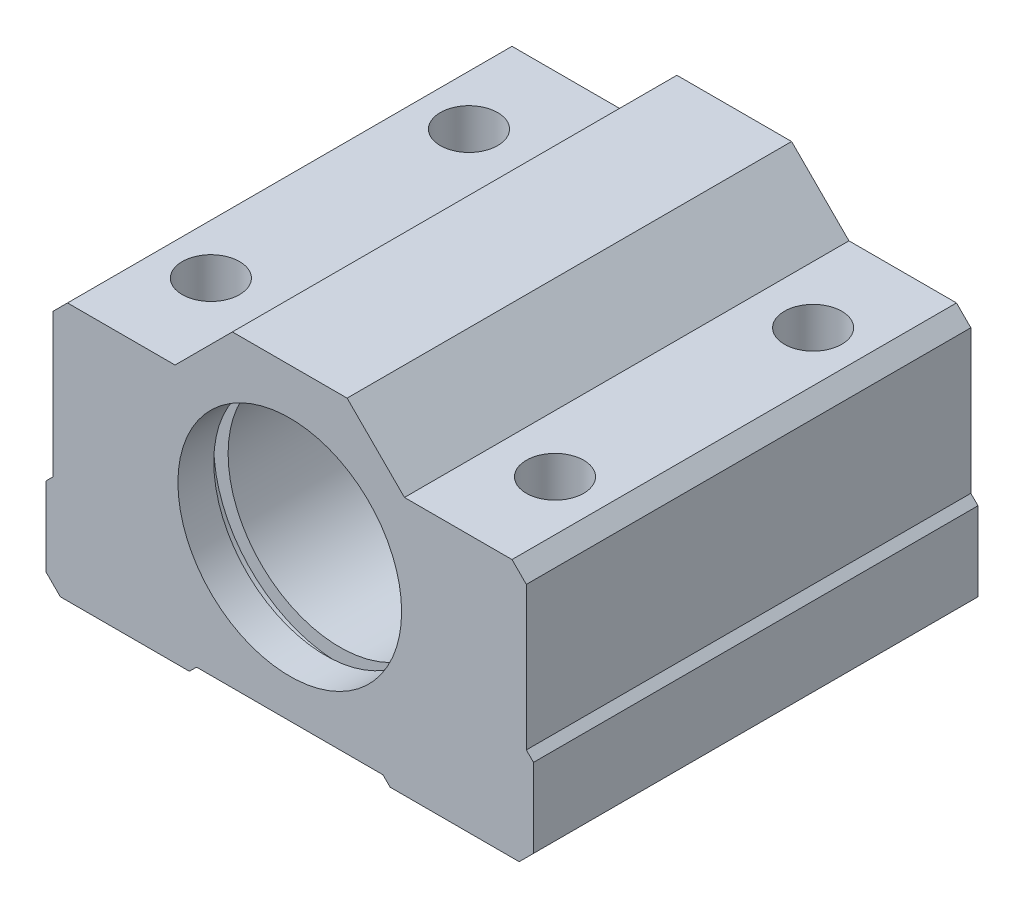
ISO-10303-21;
HEADER;
FILE_DESCRIPTION(('STEP AP214'),'2;1');
FILE_NAME('part.step','',(''),(''),'','','');
FILE_SCHEMA(('AUTOMOTIVE_DESIGN { 1 0 10303 214 1 1 1 1 }'));
ENDSEC;
DATA;
#1=APPLICATION_CONTEXT('core data for automotive mechanical design processes');
#2=APPLICATION_PROTOCOL_DEFINITION('international standard','automotive_design',2000,#1);
#3=PRODUCT_CONTEXT('',#1,'mechanical');
#4=PRODUCT('Part','Part','',(#3));
#5=PRODUCT_RELATED_PRODUCT_CATEGORY('part','',(#4));
#6=PRODUCT_DEFINITION_FORMATION('','',#4);
#7=PRODUCT_DEFINITION_CONTEXT('part definition',#1,'design');
#8=PRODUCT_DEFINITION('design','',#6,#7);
#9=PRODUCT_DEFINITION_SHAPE('','',#8);
#10=(LENGTH_UNIT() NAMED_UNIT(*) SI_UNIT(.MILLI.,.METRE.));
#11=(NAMED_UNIT(*) PLANE_ANGLE_UNIT() SI_UNIT($,.RADIAN.));
#12=(NAMED_UNIT(*) SI_UNIT($,.STERADIAN.) SOLID_ANGLE_UNIT());
#13=UNCERTAINTY_MEASURE_WITH_UNIT(LENGTH_MEASURE(1.E-05),#10,'distance_accuracy_value','');
#14=(GEOMETRIC_REPRESENTATION_CONTEXT(3) GLOBAL_UNCERTAINTY_ASSIGNED_CONTEXT((#13)) GLOBAL_UNIT_ASSIGNED_CONTEXT((#10,
#11,#12)) REPRESENTATION_CONTEXT('',''));
#15=CARTESIAN_POINT('',(0.,0.,0.));
#16=DIRECTION('',(0.,0.,1.));
#17=DIRECTION('',(1.,0.,0.));
#18=AXIS2_PLACEMENT_3D('',#15,#16,#17);
#19=CARTESIAN_POINT('',(0.,2.56889270386266,27.5));
#20=DIRECTION('',(0.,0.,1.));
#21=DIRECTION('',(1.,0.,0.));
#22=AXIS2_PLACEMENT_3D('',#19,#20,#21);
#23=CYLINDRICAL_SURFACE('',#22,8.8);
#24=CARTESIAN_POINT('',(0.,2.56889270386266,27.5));
#25=DIRECTION('',(0.,0.,1.));
#26=DIRECTION('',(1.,0.,0.));
#27=AXIS2_PLACEMENT_3D('',#24,#25,#26);
#28=CIRCLE('',#27,8.8);
#29=CARTESIAN_POINT('',(8.80000000000001,2.56889270386266,27.5));
#30=VERTEX_POINT('',#29);
#31=EDGE_CURVE('E329',#30,#30,#28,.T.);
#32=ORIENTED_EDGE('',*,*,#31,.F.);
#33=EDGE_LOOP('',(#32));
#34=FACE_BOUND('',#33,.T.);
#35=CARTESIAN_POINT('',(0.,2.56889270386266,28.5));
#36=DIRECTION('',(0.,0.,1.));
#37=DIRECTION('',(1.,0.,0.));
#38=AXIS2_PLACEMENT_3D('',#35,#36,#37);
#39=CIRCLE('',#38,8.8);
#40=CARTESIAN_POINT('',(8.80000000000001,2.56889270386266,28.5));
#41=VERTEX_POINT('',#40);
#42=EDGE_CURVE('E11',#41,#41,#39,.F.);
#43=ORIENTED_EDGE('',*,*,#42,.F.);
#44=EDGE_LOOP('',(#43));
#45=FACE_BOUND('',#44,.T.);
#46=ADVANCED_FACE('F34',(#34,#45),#23,.F.);
#47=CARTESIAN_POINT('',(0.,2.56889270386266,3.5));
#48=DIRECTION('',(0.,0.,-1.));
#49=DIRECTION('',(-1.,0.,0.));
#50=AXIS2_PLACEMENT_3D('',#47,#48,#49);
#51=CYLINDRICAL_SURFACE('',#50,8.8);
#52=CARTESIAN_POINT('',(0.,2.56889270386266,3.5));
#53=DIRECTION('',(0.,0.,-1.));
#54=DIRECTION('',(-1.,0.,0.));
#55=AXIS2_PLACEMENT_3D('',#52,#53,#54);
#56=CIRCLE('',#55,8.8);
#57=CARTESIAN_POINT('',(-8.79999999999999,2.56889270386266,3.5));
#58=VERTEX_POINT('',#57);
#59=EDGE_CURVE('E332',#58,#58,#56,.T.);
#60=ORIENTED_EDGE('',*,*,#59,.F.);
#61=EDGE_LOOP('',(#60));
#62=FACE_BOUND('',#61,.T.);
#63=CARTESIAN_POINT('',(0.,2.56889270386266,2.5));
#64=DIRECTION('',(0.,0.,-1.));
#65=DIRECTION('',(-1.,0.,0.));
#66=AXIS2_PLACEMENT_3D('',#63,#64,#65);
#67=CIRCLE('',#66,8.8);
#68=CARTESIAN_POINT('',(-8.79999999999999,2.56889270386266,2.5));
#69=VERTEX_POINT('',#68);
#70=EDGE_CURVE('E43',#69,#69,#67,.F.);
#71=ORIENTED_EDGE('',*,*,#70,.F.);
#72=EDGE_LOOP('',(#71));
#73=FACE_BOUND('',#72,.T.);
#74=ADVANCED_FACE('F338',(#62,#73),#51,.F.);
#75=CARTESIAN_POINT('',(0.,2.56889270386266,31.));
#76=DIRECTION('',(0.,0.,-1.));
#77=DIRECTION('',(-1.,0.,0.));
#78=AXIS2_PLACEMENT_3D('',#75,#76,#77);
#79=CYLINDRICAL_SURFACE('',#78,7.8);
#80=CARTESIAN_POINT('',(0.,2.56889270386266,27.5));
#81=DIRECTION('',(0.,0.,1.));
#82=DIRECTION('',(1.,0.,0.));
#83=AXIS2_PLACEMENT_3D('',#80,#81,#82);
#84=CIRCLE('',#83,7.8);
#85=CARTESIAN_POINT('',(7.80000000000001,2.56889270386266,27.5));
#86=VERTEX_POINT('',#85);
#87=EDGE_CURVE('E325',#86,#86,#84,.T.);
#88=ORIENTED_EDGE('',*,*,#87,.T.);
#89=EDGE_LOOP('',(#88));
#90=FACE_BOUND('',#89,.T.);
#91=CARTESIAN_POINT('',(0.,2.56889270386266,3.5));
#92=DIRECTION('',(0.,0.,-1.));
#93=DIRECTION('',(-1.,0.,0.));
#94=AXIS2_PLACEMENT_3D('',#91,#92,#93);
#95=CIRCLE('',#94,7.8);
#96=CARTESIAN_POINT('',(-7.8,2.56889270386266,3.5));
#97=VERTEX_POINT('',#96);
#98=EDGE_CURVE('E330',#97,#97,#95,.T.);
#99=ORIENTED_EDGE('',*,*,#98,.T.);
#100=EDGE_LOOP('',(#99));
#101=FACE_BOUND('',#100,.T.);
#102=ADVANCED_FACE('F340',(#90,#101),#79,.F.);
#103=CARTESIAN_POINT('',(0.,0.,31.));
#104=DIRECTION('',(0.,0.,-1.));
#105=DIRECTION('',(-1.,0.,0.));
#106=AXIS2_PLACEMENT_3D('',#103,#104,#105);
#107=PLANE('',#106);
#108=DIRECTION('',(-0.707106781186544,-0.707106781186551,0.));
#109=VECTOR('',#108,1.);
#110=CARTESIAN_POINT('',(-5.99999999999999,-7.43110729613733,31.));
#111=LINE('',#110,#109);
#112=CARTESIAN_POINT('',(-7.,-8.43110729613734,31.));
#113=VERTEX_POINT('',#112);
#114=CARTESIAN_POINT('',(-6.5,-7.93110729613734,31.));
#115=VERTEX_POINT('',#114);
#116=EDGE_CURVE('E316',#113,#115,#111,.F.);
#117=ORIENTED_EDGE('',*,*,#116,.T.);
#118=DIRECTION('',(1.,0.,0.));
#119=VECTOR('',#118,1.);
#120=CARTESIAN_POINT('',(-5.99999999999999,-7.93110729613734,31.));
#121=LINE('',#120,#119);
#122=CARTESIAN_POINT('',(6.50000000000002,-7.93110729613734,31.));
#123=VERTEX_POINT('',#122);
#124=EDGE_CURVE('E50',#115,#123,#121,.T.);
#125=ORIENTED_EDGE('',*,*,#124,.T.);
#126=DIRECTION('',(-0.707106781186551,0.707106781186544,0.));
#127=VECTOR('',#126,1.);
#128=CARTESIAN_POINT('',(7.00000000000002,-8.43110729613734,31.));
#129=LINE('',#128,#127);
#130=CARTESIAN_POINT('',(7.00000000000002,-8.43110729613734,31.));
#131=VERTEX_POINT('',#130);
#132=EDGE_CURVE('E314',#123,#131,#129,.F.);
#133=ORIENTED_EDGE('',*,*,#132,.T.);
#134=DIRECTION('',(1.,0.,0.));
#135=VECTOR('',#134,1.);
#136=CARTESIAN_POINT('',(6.00000000000001,-8.43110729613734,31.));
#137=LINE('',#136,#135);
#138=CARTESIAN_POINT('',(16.,-8.43110729613734,31.));
#139=VERTEX_POINT('',#138);
#140=EDGE_CURVE('E473',#131,#139,#137,.T.);
#141=ORIENTED_EDGE('',*,*,#140,.T.);
#142=DIRECTION('',(-0.707106781186548,-0.707106781186548,0.));
#143=VECTOR('',#142,1.);
#144=CARTESIAN_POINT('',(17.,-7.43110729613734,31.));
#145=LINE('',#144,#143);
#146=CARTESIAN_POINT('',(17.,-7.43110729613734,31.));
#147=VERTEX_POINT('',#146);
#148=EDGE_CURVE('E299',#139,#147,#145,.F.);
#149=ORIENTED_EDGE('',*,*,#148,.T.);
#150=DIRECTION('',(0.,1.,0.));
#151=VECTOR('',#150,1.);
#152=CARTESIAN_POINT('',(17.,-8.43110729613734,31.));
#153=LINE('',#152,#151);
#154=CARTESIAN_POINT('',(17.,-1.93110729613735,31.));
#155=VERTEX_POINT('',#154);
#156=EDGE_CURVE('E477',#147,#155,#153,.T.);
#157=ORIENTED_EDGE('',*,*,#156,.T.);
#158=DIRECTION('',(0.707106781186552,-0.707106781186544,0.));
#159=VECTOR('',#158,1.);
#160=CARTESIAN_POINT('',(16.,-0.931107296137339,31.));
#161=LINE('',#160,#159);
#162=CARTESIAN_POINT('',(16.5,-1.43110729613735,31.));
#163=VERTEX_POINT('',#162);
#164=EDGE_CURVE('E272',#155,#163,#161,.F.);
#165=ORIENTED_EDGE('',*,*,#164,.T.);
#166=DIRECTION('',(0.,1.,0.));
#167=VECTOR('',#166,1.);
#168=CARTESIAN_POINT('',(16.5,-0.931107296137339,31.));
#169=LINE('',#168,#167);
#170=CARTESIAN_POINT('',(16.5,8.56889270386266,31.));
#171=VERTEX_POINT('',#170);
#172=EDGE_CURVE('E179',#163,#171,#169,.T.);
#173=ORIENTED_EDGE('',*,*,#172,.T.);
#174=DIRECTION('',(0.707106781186548,-0.707106781186548,0.));
#175=VECTOR('',#174,1.);
#176=CARTESIAN_POINT('',(15.5,9.56889270386266,31.));
#177=LINE('',#176,#175);
#178=CARTESIAN_POINT('',(15.5,9.56889270386266,31.));
#179=VERTEX_POINT('',#178);
#180=EDGE_CURVE('E175',#171,#179,#177,.F.);
#181=ORIENTED_EDGE('',*,*,#180,.T.);
#182=DIRECTION('',(-1.,0.,0.));
#183=VECTOR('',#182,1.);
#184=CARTESIAN_POINT('',(16.5,9.56889270386266,31.));
#185=LINE('',#184,#183);
#186=CARTESIAN_POINT('',(8.,9.56889270386266,31.));
#187=VERTEX_POINT('',#186);
#188=EDGE_CURVE('E166',#179,#187,#185,.T.);
#189=ORIENTED_EDGE('',*,*,#188,.T.);
#190=DIRECTION('',(-0.707106781186548,0.707106781186547,0.));
#191=VECTOR('',#190,1.);
#192=CARTESIAN_POINT('',(8.,9.56889270386266,31.));
#193=LINE('',#192,#191);
#194=CARTESIAN_POINT('',(4.,13.5688927038627,31.));
#195=VERTEX_POINT('',#194);
#196=EDGE_CURVE('E171',#187,#195,#193,.T.);
#197=ORIENTED_EDGE('',*,*,#196,.T.);
#198=DIRECTION('',(-1.,0.,0.));
#199=VECTOR('',#198,1.);
#200=CARTESIAN_POINT('',(4.,13.5688927038627,31.));
#201=LINE('',#200,#199);
#202=CARTESIAN_POINT('',(-4.,13.5688927038627,31.));
#203=VERTEX_POINT('',#202);
#204=EDGE_CURVE('E194',#195,#203,#201,.T.);
#205=ORIENTED_EDGE('',*,*,#204,.T.);
#206=DIRECTION('',(-0.707106781186547,-0.707106781186548,0.));
#207=VECTOR('',#206,1.);
#208=CARTESIAN_POINT('',(-4.,13.5688927038627,31.));
#209=LINE('',#208,#207);
#210=CARTESIAN_POINT('',(-8.,9.56889270386266,31.));
#211=VERTEX_POINT('',#210);
#212=EDGE_CURVE('E196',#203,#211,#209,.T.);
#213=ORIENTED_EDGE('',*,*,#212,.T.);
#214=DIRECTION('',(-1.,0.,0.));
#215=VECTOR('',#214,1.);
#216=CARTESIAN_POINT('',(-8.,9.56889270386266,31.));
#217=LINE('',#216,#215);
#218=CARTESIAN_POINT('',(-15.5,9.56889270386266,31.));
#219=VERTEX_POINT('',#218);
#220=EDGE_CURVE('E201',#211,#219,#217,.T.);
#221=ORIENTED_EDGE('',*,*,#220,.T.);
#222=DIRECTION('',(0.707106781186548,0.707106781186548,0.));
#223=VECTOR('',#222,1.);
#224=CARTESIAN_POINT('',(-16.5,8.56889270386265,31.));
#225=LINE('',#224,#223);
#226=CARTESIAN_POINT('',(-16.5,8.56889270386265,31.));
#227=VERTEX_POINT('',#226);
#228=EDGE_CURVE('E255',#219,#227,#225,.F.);
#229=ORIENTED_EDGE('',*,*,#228,.T.);
#230=DIRECTION('',(0.,-1.,0.));
#231=VECTOR('',#230,1.);
#232=CARTESIAN_POINT('',(-16.5,9.56889270386266,31.));
#233=LINE('',#232,#231);
#234=CARTESIAN_POINT('',(-16.5,-1.43110729613736,31.));
#235=VERTEX_POINT('',#234);
#236=EDGE_CURVE('E204',#227,#235,#233,.T.);
#237=ORIENTED_EDGE('',*,*,#236,.T.);
#238=DIRECTION('',(0.707106781186544,0.707106781186551,0.));
#239=VECTOR('',#238,1.);
#240=CARTESIAN_POINT('',(-17.,-1.93110729613736,31.));
#241=LINE('',#240,#239);
#242=CARTESIAN_POINT('',(-17.,-1.93110729613736,31.));
#243=VERTEX_POINT('',#242);
#244=EDGE_CURVE('E275',#235,#243,#241,.F.);
#245=ORIENTED_EDGE('',*,*,#244,.T.);
#246=DIRECTION('',(0.,-1.,0.));
#247=VECTOR('',#246,1.);
#248=CARTESIAN_POINT('',(-17.,-0.931107296137343,31.));
#249=LINE('',#248,#247);
#250=CARTESIAN_POINT('',(-17.,-7.43110729613734,31.));
#251=VERTEX_POINT('',#250);
#252=EDGE_CURVE('E206',#243,#251,#249,.T.);
#253=ORIENTED_EDGE('',*,*,#252,.T.);
#254=DIRECTION('',(-0.707106781186548,0.707106781186548,0.));
#255=VECTOR('',#254,1.);
#256=CARTESIAN_POINT('',(-16.,-8.43110729613734,31.));
#257=LINE('',#256,#255);
#258=CARTESIAN_POINT('',(-16.,-8.43110729613734,31.));
#259=VERTEX_POINT('',#258);
#260=EDGE_CURVE('E297',#251,#259,#257,.F.);
#261=ORIENTED_EDGE('',*,*,#260,.T.);
#262=DIRECTION('',(1.,0.,0.));
#263=VECTOR('',#262,1.);
#264=CARTESIAN_POINT('',(-17.,-8.43110729613734,31.));
#265=LINE('',#264,#263);
#266=EDGE_CURVE('E209',#259,#113,#265,.T.);
#267=ORIENTED_EDGE('',*,*,#266,.T.);
#268=EDGE_LOOP('',(#117,#125,#133,#141,#149,#157,#165,#173,#181,#189,#197,#205,#213,#221,#229,
#237,#245,#253,#261,#267));
#269=FACE_BOUND('',#268,.T.);
#270=CARTESIAN_POINT('',(0.,2.56889270386266,31.));
#271=DIRECTION('',(0.,0.,1.));
#272=DIRECTION('',(1.,0.,0.));
#273=AXIS2_PLACEMENT_3D('',#270,#271,#272);
#274=CIRCLE('',#273,7.8);
#275=CARTESIAN_POINT('',(7.8,2.56889270386266,31.));
#276=VERTEX_POINT('',#275);
#277=EDGE_CURVE('E539',#276,#276,#274,.T.);
#278=ORIENTED_EDGE('',*,*,#277,.F.);
#279=EDGE_LOOP('',(#278));
#280=FACE_BOUND('',#279,.T.);
#281=ADVANCED_FACE('F168',(#269,#280),#107,.F.);
#282=CARTESIAN_POINT('',(0.,0.,0.));
#283=DIRECTION('',(0.,0.,-1.));
#284=DIRECTION('',(-1.,0.,0.));
#285=AXIS2_PLACEMENT_3D('',#282,#283,#284);
#286=PLANE('',#285);
#287=DIRECTION('',(1.,0.,0.));
#288=VECTOR('',#287,1.);
#289=CARTESIAN_POINT('',(-5.99999999999999,-7.93110729613734,0.));
#290=LINE('',#289,#288);
#291=CARTESIAN_POINT('',(-6.5,-7.93110729613734,0.));
#292=VERTEX_POINT('',#291);
#293=CARTESIAN_POINT('',(6.50000000000002,-7.93110729613734,0.));
#294=VERTEX_POINT('',#293);
#295=EDGE_CURVE('E213',#292,#294,#290,.T.);
#296=ORIENTED_EDGE('',*,*,#295,.F.);
#297=DIRECTION('',(0.707106781186544,0.707106781186551,0.));
#298=VECTOR('',#297,1.);
#299=CARTESIAN_POINT('',(0.715553648068634,-0.715553648068627,0.));
#300=LINE('',#299,#298);
#301=CARTESIAN_POINT('',(-7.,-8.43110729613734,0.));
#302=VERTEX_POINT('',#301);
#303=EDGE_CURVE('E309',#292,#302,#300,.F.);
#304=ORIENTED_EDGE('',*,*,#303,.T.);
#305=DIRECTION('',(1.,0.,0.));
#306=VECTOR('',#305,1.);
#307=CARTESIAN_POINT('',(-17.,-8.43110729613734,0.));
#308=LINE('',#307,#306);
#309=CARTESIAN_POINT('',(-16.,-8.43110729613734,0.));
#310=VERTEX_POINT('',#309);
#311=EDGE_CURVE('E239',#310,#302,#308,.T.);
#312=ORIENTED_EDGE('',*,*,#311,.F.);
#313=DIRECTION('',(0.707106781186548,-0.707106781186548,0.));
#314=VECTOR('',#313,1.);
#315=CARTESIAN_POINT('',(-12.2155536480687,-12.2155536480687,0.));
#316=LINE('',#315,#314);
#317=CARTESIAN_POINT('',(-17.,-7.43110729613734,0.));
#318=VERTEX_POINT('',#317);
#319=EDGE_CURVE('E289',#310,#318,#316,.F.);
#320=ORIENTED_EDGE('',*,*,#319,.T.);
#321=DIRECTION('',(0.,-1.,0.));
#322=VECTOR('',#321,1.);
#323=CARTESIAN_POINT('',(-17.,-0.931107296137343,0.));
#324=LINE('',#323,#322);
#325=CARTESIAN_POINT('',(-17.,-1.93110729613736,0.));
#326=VERTEX_POINT('',#325);
#327=EDGE_CURVE('E236',#326,#318,#324,.T.);
#328=ORIENTED_EDGE('',*,*,#327,.F.);
#329=DIRECTION('',(-0.707106781186544,-0.707106781186551,0.));
#330=VECTOR('',#329,1.);
#331=CARTESIAN_POINT('',(-7.5344463519314,7.53444635193133,0.));
#332=LINE('',#331,#330);
#333=CARTESIAN_POINT('',(-16.5,-1.43110729613736,0.));
#334=VERTEX_POINT('',#333);
#335=EDGE_CURVE('E269',#326,#334,#332,.F.);
#336=ORIENTED_EDGE('',*,*,#335,.T.);
#337=DIRECTION('',(0.,-1.,0.));
#338=VECTOR('',#337,1.);
#339=CARTESIAN_POINT('',(-16.5,9.56889270386266,0.));
#340=LINE('',#339,#338);
#341=CARTESIAN_POINT('',(-16.5,8.56889270386265,0.));
#342=VERTEX_POINT('',#341);
#343=EDGE_CURVE('E234',#342,#334,#340,.T.);
#344=ORIENTED_EDGE('',*,*,#343,.F.);
#345=DIRECTION('',(-0.707106781186548,-0.707106781186548,0.));
#346=VECTOR('',#345,1.);
#347=CARTESIAN_POINT('',(-12.5344463519313,12.5344463519313,0.));
#348=LINE('',#347,#346);
#349=CARTESIAN_POINT('',(-15.5,9.56889270386266,0.));
#350=VERTEX_POINT('',#349);
#351=EDGE_CURVE('E249',#342,#350,#348,.F.);
#352=ORIENTED_EDGE('',*,*,#351,.T.);
#353=DIRECTION('',(-1.,0.,0.));
#354=VECTOR('',#353,1.);
#355=CARTESIAN_POINT('',(-8.,9.56889270386266,0.));
#356=LINE('',#355,#354);
#357=CARTESIAN_POINT('',(-8.,9.56889270386266,0.));
#358=VERTEX_POINT('',#357);
#359=EDGE_CURVE('E231',#358,#350,#356,.T.);
#360=ORIENTED_EDGE('',*,*,#359,.F.);
#361=DIRECTION('',(-0.707106781186547,-0.707106781186548,0.));
#362=VECTOR('',#361,1.);
#363=CARTESIAN_POINT('',(-4.,13.5688927038627,0.));
#364=LINE('',#363,#362);
#365=CARTESIAN_POINT('',(-4.,13.5688927038627,0.));
#366=VERTEX_POINT('',#365);
#367=EDGE_CURVE('E229',#366,#358,#364,.T.);
#368=ORIENTED_EDGE('',*,*,#367,.F.);
#369=DIRECTION('',(-1.,0.,0.));
#370=VECTOR('',#369,1.);
#371=CARTESIAN_POINT('',(4.,13.5688927038627,0.));
#372=LINE('',#371,#370);
#373=CARTESIAN_POINT('',(4.,13.5688927038627,0.));
#374=VERTEX_POINT('',#373);
#375=EDGE_CURVE('E227',#374,#366,#372,.T.);
#376=ORIENTED_EDGE('',*,*,#375,.F.);
#377=DIRECTION('',(-0.707106781186548,0.707106781186547,0.));
#378=VECTOR('',#377,1.);
#379=CARTESIAN_POINT('',(8.,9.56889270386266,0.));
#380=LINE('',#379,#378);
#381=CARTESIAN_POINT('',(8.,9.56889270386266,0.));
#382=VERTEX_POINT('',#381);
#383=EDGE_CURVE('E225',#382,#374,#380,.T.);
#384=ORIENTED_EDGE('',*,*,#383,.F.);
#385=DIRECTION('',(-1.,0.,0.));
#386=VECTOR('',#385,1.);
#387=CARTESIAN_POINT('',(16.5,9.56889270386266,0.));
#388=LINE('',#387,#386);
#389=CARTESIAN_POINT('',(15.5,9.56889270386266,0.));
#390=VERTEX_POINT('',#389);
#391=EDGE_CURVE('E185',#390,#382,#388,.T.);
#392=ORIENTED_EDGE('',*,*,#391,.F.);
#393=DIRECTION('',(-0.707106781186548,0.707106781186548,0.));
#394=VECTOR('',#393,1.);
#395=CARTESIAN_POINT('',(12.5344463519313,12.5344463519313,0.));
#396=LINE('',#395,#394);
#397=CARTESIAN_POINT('',(16.5,8.56889270386266,0.));
#398=VERTEX_POINT('',#397);
#399=EDGE_CURVE('E251',#390,#398,#396,.F.);
#400=ORIENTED_EDGE('',*,*,#399,.T.);
#401=DIRECTION('',(0.,1.,0.));
#402=VECTOR('',#401,1.);
#403=CARTESIAN_POINT('',(16.5,-0.931107296137339,0.));
#404=LINE('',#403,#402);
#405=CARTESIAN_POINT('',(16.5,-1.43110729613735,0.));
#406=VERTEX_POINT('',#405);
#407=EDGE_CURVE('E221',#406,#398,#404,.T.);
#408=ORIENTED_EDGE('',*,*,#407,.F.);
#409=DIRECTION('',(-0.707106781186552,0.707106781186544,0.));
#410=VECTOR('',#409,1.);
#411=CARTESIAN_POINT('',(7.53444635193124,7.53444635193132,0.));
#412=LINE('',#411,#410);
#413=CARTESIAN_POINT('',(17.,-1.93110729613735,0.));
#414=VERTEX_POINT('',#413);
#415=EDGE_CURVE('E266',#406,#414,#412,.F.);
#416=ORIENTED_EDGE('',*,*,#415,.T.);
#417=DIRECTION('',(0.,1.,0.));
#418=VECTOR('',#417,1.);
#419=CARTESIAN_POINT('',(17.,-8.43110729613734,0.));
#420=LINE('',#419,#418);
#421=CARTESIAN_POINT('',(17.,-7.43110729613733,0.));
#422=VERTEX_POINT('',#421);
#423=EDGE_CURVE('E219',#422,#414,#420,.T.);
#424=ORIENTED_EDGE('',*,*,#423,.F.);
#425=DIRECTION('',(0.707106781186548,0.707106781186548,0.));
#426=VECTOR('',#425,1.);
#427=CARTESIAN_POINT('',(12.2155536480687,-12.2155536480687,0.));
#428=LINE('',#427,#426);
#429=CARTESIAN_POINT('',(16.,-8.43110729613734,0.));
#430=VERTEX_POINT('',#429);
#431=EDGE_CURVE('E291',#422,#430,#428,.F.);
#432=ORIENTED_EDGE('',*,*,#431,.T.);
#433=DIRECTION('',(1.,0.,0.));
#434=VECTOR('',#433,1.);
#435=CARTESIAN_POINT('',(6.00000000000001,-8.43110729613734,0.));
#436=LINE('',#435,#434);
#437=CARTESIAN_POINT('',(7.00000000000002,-8.43110729613734,0.));
#438=VERTEX_POINT('',#437);
#439=EDGE_CURVE('E216',#438,#430,#436,.T.);
#440=ORIENTED_EDGE('',*,*,#439,.F.);
#441=DIRECTION('',(0.707106781186551,-0.707106781186544,0.));
#442=VECTOR('',#441,1.);
#443=CARTESIAN_POINT('',(-0.715553648068694,-0.715553648068701,0.));
#444=LINE('',#443,#442);
#445=EDGE_CURVE('E306',#438,#294,#444,.F.);
#446=ORIENTED_EDGE('',*,*,#445,.T.);
#447=EDGE_LOOP('',(#296,#304,#312,#320,#328,#336,#344,#352,#360,#368,#376,#384,#392,#400,#408,
#416,#424,#432,#440,#446));
#448=FACE_BOUND('',#447,.T.);
#449=CARTESIAN_POINT('',(0.,2.56889270386266,0.));
#450=DIRECTION('',(0.,0.,-1.));
#451=DIRECTION('',(-1.,0.,0.));
#452=AXIS2_PLACEMENT_3D('',#449,#450,#451);
#453=CIRCLE('',#452,7.8);
#454=CARTESIAN_POINT('',(-7.8,2.56889270386266,0.));
#455=VERTEX_POINT('',#454);
#456=EDGE_CURVE('E533',#455,#455,#453,.T.);
#457=ORIENTED_EDGE('',*,*,#456,.F.);
#458=EDGE_LOOP('',(#457));
#459=FACE_BOUND('',#458,.T.);
#460=ADVANCED_FACE('F378',(#448,#459),#286,.T.);
#461=CARTESIAN_POINT('',(-5.99999999999999,-7.93110729613734,31.));
#462=DIRECTION('',(0.,1.,0.));
#463=DIRECTION('',(-1.,0.,0.));
#464=AXIS2_PLACEMENT_3D('',#461,#462,#463);
#465=PLANE('',#464);
#466=ORIENTED_EDGE('',*,*,#295,.T.);
#467=DIRECTION('',(0.,0.,-1.));
#468=VECTOR('',#467,1.);
#469=CARTESIAN_POINT('',(6.50000000000002,-7.93110729613734,31.));
#470=LINE('',#469,#468);
#471=EDGE_CURVE('E323',#294,#123,#470,.F.);
#472=ORIENTED_EDGE('',*,*,#471,.T.);
#473=ORIENTED_EDGE('',*,*,#124,.F.);
#474=DIRECTION('',(0.,0.,1.));
#475=VECTOR('',#474,1.);
#476=CARTESIAN_POINT('',(-6.5,-7.93110729613734,31.));
#477=LINE('',#476,#475);
#478=EDGE_CURVE('E321',#115,#292,#477,.F.);
#479=ORIENTED_EDGE('',*,*,#478,.T.);
#480=EDGE_LOOP('',(#466,#472,#473,#479));
#481=FACE_BOUND('',#480,.T.);
#482=ADVANCED_FACE('F381',(#481),#465,.F.);
#483=CARTESIAN_POINT('',(6.00000000000001,-8.43110729613734,31.));
#484=DIRECTION('',(0.,1.,0.));
#485=DIRECTION('',(0.,0.,1.));
#486=AXIS2_PLACEMENT_3D('',#483,#484,#485);
#487=PLANE('',#486);
#488=CARTESIAN_POINT('',(12.,-8.43110729613734,24.5));
#489=DIRECTION('',(0.,-1.,0.));
#490=DIRECTION('',(0.,0.,-1.));
#491=AXIS2_PLACEMENT_3D('',#488,#489,#490);
#492=CIRCLE('',#491,2.);
#493=CARTESIAN_POINT('',(12.,-8.43110729613734,22.5));
#494=VERTEX_POINT('',#493);
#495=EDGE_CURVE('E328',#494,#494,#492,.T.);
#496=ORIENTED_EDGE('',*,*,#495,.F.);
#497=EDGE_LOOP('',(#496));
#498=FACE_BOUND('',#497,.T.);
#499=CARTESIAN_POINT('',(12.,-8.43110729613734,6.5));
#500=DIRECTION('',(0.,-1.,0.));
#501=DIRECTION('',(0.,0.,-1.));
#502=AXIS2_PLACEMENT_3D('',#499,#500,#501);
#503=CIRCLE('',#502,2.);
#504=CARTESIAN_POINT('',(12.,-8.43110729613734,4.5));
#505=VERTEX_POINT('',#504);
#506=EDGE_CURVE('E520',#505,#505,#503,.T.);
#507=ORIENTED_EDGE('',*,*,#506,.F.);
#508=EDGE_LOOP('',(#507));
#509=FACE_BOUND('',#508,.T.);
#510=ORIENTED_EDGE('',*,*,#140,.F.);
#511=DIRECTION('',(0.,0.,-1.));
#512=VECTOR('',#511,1.);
#513=CARTESIAN_POINT('',(7.00000000000002,-8.43110729613734,31.));
#514=LINE('',#513,#512);
#515=EDGE_CURVE('E318',#131,#438,#514,.T.);
#516=ORIENTED_EDGE('',*,*,#515,.T.);
#517=ORIENTED_EDGE('',*,*,#439,.T.);
#518=DIRECTION('',(0.,0.,1.));
#519=VECTOR('',#518,1.);
#520=CARTESIAN_POINT('',(16.,-8.43110729613734,31.));
#521=LINE('',#520,#519);
#522=EDGE_CURVE('E294',#430,#139,#521,.T.);
#523=ORIENTED_EDGE('',*,*,#522,.T.);
#524=EDGE_LOOP('',(#510,#516,#517,#523));
#525=FACE_BOUND('',#524,.T.);
#526=ADVANCED_FACE('F420',(#498,#509,#525),#487,.F.);
#527=CARTESIAN_POINT('',(17.,-8.43110729613734,31.));
#528=DIRECTION('',(-1.,0.,0.));
#529=DIRECTION('',(0.,0.,1.));
#530=AXIS2_PLACEMENT_3D('',#527,#528,#529);
#531=PLANE('',#530);
#532=ORIENTED_EDGE('',*,*,#156,.F.);
#533=DIRECTION('',(0.,0.,-1.));
#534=VECTOR('',#533,1.);
#535=CARTESIAN_POINT('',(17.,-7.43110729613734,31.));
#536=LINE('',#535,#534);
#537=EDGE_CURVE('E286',#147,#422,#536,.T.);
#538=ORIENTED_EDGE('',*,*,#537,.T.);
#539=ORIENTED_EDGE('',*,*,#423,.T.);
#540=DIRECTION('',(0.,0.,1.));
#541=VECTOR('',#540,1.);
#542=CARTESIAN_POINT('',(17.,-1.93110729613735,31.));
#543=LINE('',#542,#541);
#544=EDGE_CURVE('E277',#414,#155,#543,.T.);
#545=ORIENTED_EDGE('',*,*,#544,.T.);
#546=EDGE_LOOP('',(#532,#538,#539,#545));
#547=FACE_BOUND('',#546,.T.);
#548=ADVANCED_FACE('F416',(#547),#531,.F.);
#549=CARTESIAN_POINT('',(16.5,-0.931107296137339,31.));
#550=DIRECTION('',(-1.,0.,0.));
#551=DIRECTION('',(0.,-1.,0.));
#552=AXIS2_PLACEMENT_3D('',#549,#550,#551);
#553=PLANE('',#552);
#554=ORIENTED_EDGE('',*,*,#407,.T.);
#555=DIRECTION('',(0.,0.,1.));
#556=VECTOR('',#555,1.);
#557=CARTESIAN_POINT('',(16.5,8.56889270386266,31.));
#558=LINE('',#557,#556);
#559=EDGE_CURVE('E253',#398,#171,#558,.T.);
#560=ORIENTED_EDGE('',*,*,#559,.T.);
#561=ORIENTED_EDGE('',*,*,#172,.F.);
#562=DIRECTION('',(0.,0.,1.));
#563=VECTOR('',#562,1.);
#564=CARTESIAN_POINT('',(16.5,-1.43110729613735,31.));
#565=LINE('',#564,#563);
#566=EDGE_CURVE('E283',#163,#406,#565,.F.);
#567=ORIENTED_EDGE('',*,*,#566,.T.);
#568=EDGE_LOOP('',(#554,#560,#561,#567));
#569=FACE_BOUND('',#568,.T.);
#570=ADVANCED_FACE('F412',(#569),#553,.F.);
#571=CARTESIAN_POINT('',(16.5,9.56889270386266,31.));
#572=DIRECTION('',(0.,-1.,0.));
#573=DIRECTION('',(0.,0.,-1.));
#574=AXIS2_PLACEMENT_3D('',#571,#572,#573);
#575=PLANE('',#574);
#576=CARTESIAN_POINT('',(12.,9.56889270386267,24.5));
#577=DIRECTION('',(0.,-1.,0.));
#578=DIRECTION('',(1.,0.,0.));
#579=AXIS2_PLACEMENT_3D('',#576,#577,#578);
#580=CIRCLE('',#579,2.);
#581=CARTESIAN_POINT('',(14.,9.56889270386267,24.5));
#582=VERTEX_POINT('',#581);
#583=EDGE_CURVE('E523',#582,#582,#580,.F.);
#584=ORIENTED_EDGE('',*,*,#583,.F.);
#585=EDGE_LOOP('',(#584));
#586=FACE_BOUND('',#585,.T.);
#587=CARTESIAN_POINT('',(12.,9.56889270386267,6.5));
#588=DIRECTION('',(0.,-1.,0.));
#589=DIRECTION('',(1.,0.,0.));
#590=AXIS2_PLACEMENT_3D('',#587,#588,#589);
#591=CIRCLE('',#590,2.);
#592=CARTESIAN_POINT('',(14.,9.56889270386267,6.5));
#593=VERTEX_POINT('',#592);
#594=EDGE_CURVE('E517',#593,#593,#591,.F.);
#595=ORIENTED_EDGE('',*,*,#594,.F.);
#596=EDGE_LOOP('',(#595));
#597=FACE_BOUND('',#596,.T.);
#598=ORIENTED_EDGE('',*,*,#188,.F.);
#599=DIRECTION('',(0.,0.,-1.));
#600=VECTOR('',#599,1.);
#601=CARTESIAN_POINT('',(15.5,9.56889270386266,31.));
#602=LINE('',#601,#600);
#603=EDGE_CURVE('E188',#179,#390,#602,.T.);
#604=ORIENTED_EDGE('',*,*,#603,.T.);
#605=ORIENTED_EDGE('',*,*,#391,.T.);
#606=DIRECTION('',(0.,0.,-1.));
#607=VECTOR('',#606,1.);
#608=CARTESIAN_POINT('',(8.,9.56889270386266,31.));
#609=LINE('',#608,#607);
#610=EDGE_CURVE('E182',#187,#382,#609,.T.);
#611=ORIENTED_EDGE('',*,*,#610,.F.);
#612=EDGE_LOOP('',(#598,#604,#605,#611));
#613=FACE_BOUND('',#612,.T.);
#614=ADVANCED_FACE('F183',(#586,#597,#613),#575,.F.);
#615=CARTESIAN_POINT('',(8.,9.56889270386266,31.));
#616=DIRECTION('',(-0.707106781186547,-0.707106781186548,0.));
#617=DIRECTION('',(0.707106781186548,-0.707106781186547,0.));
#618=AXIS2_PLACEMENT_3D('',#615,#616,#617);
#619=PLANE('',#618);
#620=ORIENTED_EDGE('',*,*,#383,.T.);
#621=DIRECTION('',(0.,0.,-1.));
#622=VECTOR('',#621,1.);
#623=CARTESIAN_POINT('',(4.,13.5688927038627,31.));
#624=LINE('',#623,#622);
#625=EDGE_CURVE('E189',#195,#374,#624,.T.);
#626=ORIENTED_EDGE('',*,*,#625,.F.);
#627=ORIENTED_EDGE('',*,*,#196,.F.);
#628=ORIENTED_EDGE('',*,*,#610,.T.);
#629=EDGE_LOOP('',(#620,#626,#627,#628));
#630=FACE_BOUND('',#629,.T.);
#631=ADVANCED_FACE('F191',(#630),#619,.F.);
#632=CARTESIAN_POINT('',(4.,13.5688927038627,31.));
#633=DIRECTION('',(0.,-1.,0.));
#634=DIRECTION('',(1.,0.,0.));
#635=AXIS2_PLACEMENT_3D('',#632,#633,#634);
#636=PLANE('',#635);
#637=ORIENTED_EDGE('',*,*,#375,.T.);
#638=DIRECTION('',(0.,0.,-1.));
#639=VECTOR('',#638,1.);
#640=CARTESIAN_POINT('',(-4.,13.5688927038627,31.));
#641=LINE('',#640,#639);
#642=EDGE_CURVE('E244',#203,#366,#641,.T.);
#643=ORIENTED_EDGE('',*,*,#642,.F.);
#644=ORIENTED_EDGE('',*,*,#204,.F.);
#645=ORIENTED_EDGE('',*,*,#625,.T.);
#646=EDGE_LOOP('',(#637,#643,#644,#645));
#647=FACE_BOUND('',#646,.T.);
#648=ADVANCED_FACE('F403',(#647),#636,.F.);
#649=CARTESIAN_POINT('',(-4.,13.5688927038627,31.));
#650=DIRECTION('',(0.707106781186548,-0.707106781186547,0.));
#651=DIRECTION('',(0.707106781186547,0.707106781186548,0.));
#652=AXIS2_PLACEMENT_3D('',#649,#650,#651);
#653=PLANE('',#652);
#654=ORIENTED_EDGE('',*,*,#367,.T.);
#655=DIRECTION('',(0.,0.,-1.));
#656=VECTOR('',#655,1.);
#657=CARTESIAN_POINT('',(-8.,9.56889270386266,31.));
#658=LINE('',#657,#656);
#659=EDGE_CURVE('E212',#211,#358,#658,.T.);
#660=ORIENTED_EDGE('',*,*,#659,.F.);
#661=ORIENTED_EDGE('',*,*,#212,.F.);
#662=ORIENTED_EDGE('',*,*,#642,.T.);
#663=EDGE_LOOP('',(#654,#660,#661,#662));
#664=FACE_BOUND('',#663,.T.);
#665=ADVANCED_FACE('F399',(#664),#653,.F.);
#666=CARTESIAN_POINT('',(-8.,9.56889270386266,31.));
#667=DIRECTION('',(0.,-1.,0.));
#668=DIRECTION('',(1.,0.,0.));
#669=AXIS2_PLACEMENT_3D('',#666,#667,#668);
#670=PLANE('',#669);
#671=CARTESIAN_POINT('',(-12.,9.56889270386266,24.5));
#672=DIRECTION('',(0.,-1.,0.));
#673=DIRECTION('',(1.,0.,0.));
#674=AXIS2_PLACEMENT_3D('',#671,#672,#673);
#675=CIRCLE('',#674,2.);
#676=CARTESIAN_POINT('',(-10.,9.56889270386266,24.5));
#677=VERTEX_POINT('',#676);
#678=EDGE_CURVE('E511',#677,#677,#675,.F.);
#679=ORIENTED_EDGE('',*,*,#678,.F.);
#680=EDGE_LOOP('',(#679));
#681=FACE_BOUND('',#680,.T.);
#682=CARTESIAN_POINT('',(-12.,9.56889270386266,6.5));
#683=DIRECTION('',(0.,-1.,0.));
#684=DIRECTION('',(1.,0.,0.));
#685=AXIS2_PLACEMENT_3D('',#682,#683,#684);
#686=CIRCLE('',#685,2.);
#687=CARTESIAN_POINT('',(-10.,9.56889270386266,6.5));
#688=VERTEX_POINT('',#687);
#689=EDGE_CURVE('E217',#688,#688,#686,.F.);
#690=ORIENTED_EDGE('',*,*,#689,.F.);
#691=EDGE_LOOP('',(#690));
#692=FACE_BOUND('',#691,.T.);
#693=ORIENTED_EDGE('',*,*,#359,.T.);
#694=DIRECTION('',(0.,0.,1.));
#695=VECTOR('',#694,1.);
#696=CARTESIAN_POINT('',(-15.5,9.56889270386266,31.));
#697=LINE('',#696,#695);
#698=EDGE_CURVE('E261',#350,#219,#697,.T.);
#699=ORIENTED_EDGE('',*,*,#698,.T.);
#700=ORIENTED_EDGE('',*,*,#220,.F.);
#701=ORIENTED_EDGE('',*,*,#659,.T.);
#702=EDGE_LOOP('',(#693,#699,#700,#701));
#703=FACE_BOUND('',#702,.T.);
#704=ADVANCED_FACE('F395',(#681,#692,#703),#670,.F.);
#705=CARTESIAN_POINT('',(-16.5,9.56889270386266,31.));
#706=DIRECTION('',(1.,0.,0.));
#707=DIRECTION('',(0.,0.,-1.));
#708=AXIS2_PLACEMENT_3D('',#705,#706,#707);
#709=PLANE('',#708);
#710=ORIENTED_EDGE('',*,*,#236,.F.);
#711=DIRECTION('',(0.,0.,-1.));
#712=VECTOR('',#711,1.);
#713=CARTESIAN_POINT('',(-16.5,8.56889270386265,31.));
#714=LINE('',#713,#712);
#715=EDGE_CURVE('E258',#227,#342,#714,.T.);
#716=ORIENTED_EDGE('',*,*,#715,.T.);
#717=ORIENTED_EDGE('',*,*,#343,.T.);
#718=DIRECTION('',(0.,0.,-1.));
#719=VECTOR('',#718,1.);
#720=CARTESIAN_POINT('',(-16.5,-1.43110729613736,31.));
#721=LINE('',#720,#719);
#722=EDGE_CURVE('E280',#334,#235,#721,.F.);
#723=ORIENTED_EDGE('',*,*,#722,.T.);
#724=EDGE_LOOP('',(#710,#716,#717,#723));
#725=FACE_BOUND('',#724,.T.);
#726=ADVANCED_FACE('F391',(#725),#709,.F.);
#727=CARTESIAN_POINT('',(-17.,-0.931107296137343,31.));
#728=DIRECTION('',(1.,0.,0.));
#729=DIRECTION('',(0.,0.,-1.));
#730=AXIS2_PLACEMENT_3D('',#727,#728,#729);
#731=PLANE('',#730);
#732=ORIENTED_EDGE('',*,*,#327,.T.);
#733=DIRECTION('',(0.,0.,1.));
#734=VECTOR('',#733,1.);
#735=CARTESIAN_POINT('',(-17.,-7.43110729613734,31.));
#736=LINE('',#735,#734);
#737=EDGE_CURVE('E304',#318,#251,#736,.T.);
#738=ORIENTED_EDGE('',*,*,#737,.T.);
#739=ORIENTED_EDGE('',*,*,#252,.F.);
#740=DIRECTION('',(0.,0.,-1.));
#741=VECTOR('',#740,1.);
#742=CARTESIAN_POINT('',(-17.,-1.93110729613736,31.));
#743=LINE('',#742,#741);
#744=EDGE_CURVE('E263',#243,#326,#743,.T.);
#745=ORIENTED_EDGE('',*,*,#744,.T.);
#746=EDGE_LOOP('',(#732,#738,#739,#745));
#747=FACE_BOUND('',#746,.T.);
#748=ADVANCED_FACE('F387',(#747),#731,.F.);
#749=CARTESIAN_POINT('',(-17.,-8.43110729613734,31.));
#750=DIRECTION('',(0.,1.,0.));
#751=DIRECTION('',(0.,0.,1.));
#752=AXIS2_PLACEMENT_3D('',#749,#750,#751);
#753=PLANE('',#752);
#754=CARTESIAN_POINT('',(-12.,-8.43110729613734,24.5));
#755=DIRECTION('',(0.,-1.,0.));
#756=DIRECTION('',(0.,0.,-1.));
#757=AXIS2_PLACEMENT_3D('',#754,#755,#756);
#758=CIRCLE('',#757,2.);
#759=CARTESIAN_POINT('',(-12.,-8.43110729613734,22.5));
#760=VERTEX_POINT('',#759);
#761=EDGE_CURVE('E514',#760,#760,#758,.T.);
#762=ORIENTED_EDGE('',*,*,#761,.F.);
#763=EDGE_LOOP('',(#762));
#764=FACE_BOUND('',#763,.T.);
#765=CARTESIAN_POINT('',(-12.,-8.43110729613734,6.5));
#766=DIRECTION('',(0.,-1.,0.));
#767=DIRECTION('',(0.,0.,-1.));
#768=AXIS2_PLACEMENT_3D('',#765,#766,#767);
#769=CIRCLE('',#768,2.);
#770=CARTESIAN_POINT('',(-12.,-8.43110729613734,4.5));
#771=VERTEX_POINT('',#770);
#772=EDGE_CURVE('E508',#771,#771,#769,.T.);
#773=ORIENTED_EDGE('',*,*,#772,.F.);
#774=EDGE_LOOP('',(#773));
#775=FACE_BOUND('',#774,.T.);
#776=ORIENTED_EDGE('',*,*,#311,.T.);
#777=DIRECTION('',(0.,0.,1.));
#778=VECTOR('',#777,1.);
#779=CARTESIAN_POINT('',(-7.,-8.43110729613734,31.));
#780=LINE('',#779,#778);
#781=EDGE_CURVE('E311',#302,#113,#780,.T.);
#782=ORIENTED_EDGE('',*,*,#781,.T.);
#783=ORIENTED_EDGE('',*,*,#266,.F.);
#784=DIRECTION('',(0.,0.,-1.));
#785=VECTOR('',#784,1.);
#786=CARTESIAN_POINT('',(-16.,-8.43110729613734,31.));
#787=LINE('',#786,#785);
#788=EDGE_CURVE('E301',#259,#310,#787,.T.);
#789=ORIENTED_EDGE('',*,*,#788,.T.);
#790=EDGE_LOOP('',(#776,#782,#783,#789));
#791=FACE_BOUND('',#790,.T.);
#792=ADVANCED_FACE('F383',(#764,#775,#791),#753,.F.);
#793=CARTESIAN_POINT('',(15.5,9.56889270386266,31.));
#794=DIRECTION('',(-0.707106781186547,-0.707106781186547,0.));
#795=DIRECTION('',(0.,0.,-1.));
#796=AXIS2_PLACEMENT_3D('',#793,#794,#795);
#797=PLANE('',#796);
#798=ORIENTED_EDGE('',*,*,#180,.F.);
#799=ORIENTED_EDGE('',*,*,#559,.F.);
#800=ORIENTED_EDGE('',*,*,#399,.F.);
#801=ORIENTED_EDGE('',*,*,#603,.F.);
#802=EDGE_LOOP('',(#798,#799,#800,#801));
#803=FACE_BOUND('',#802,.T.);
#804=ADVANCED_FACE('F386',(#803),#797,.F.);
#805=CARTESIAN_POINT('',(-16.5,8.56889270386265,31.));
#806=DIRECTION('',(0.707106781186547,-0.707106781186547,0.));
#807=DIRECTION('',(0.,0.,-1.));
#808=AXIS2_PLACEMENT_3D('',#805,#806,#807);
#809=PLANE('',#808);
#810=ORIENTED_EDGE('',*,*,#228,.F.);
#811=ORIENTED_EDGE('',*,*,#698,.F.);
#812=ORIENTED_EDGE('',*,*,#351,.F.);
#813=ORIENTED_EDGE('',*,*,#715,.F.);
#814=EDGE_LOOP('',(#810,#811,#812,#813));
#815=FACE_BOUND('',#814,.T.);
#816=ADVANCED_FACE('F429',(#815),#809,.F.);
#817=CARTESIAN_POINT('',(-17.,-1.93110729613736,31.));
#818=DIRECTION('',(0.707106781186551,-0.707106781186544,0.));
#819=DIRECTION('',(0.,0.,-1.));
#820=AXIS2_PLACEMENT_3D('',#817,#818,#819);
#821=PLANE('',#820);
#822=ORIENTED_EDGE('',*,*,#244,.F.);
#823=ORIENTED_EDGE('',*,*,#722,.F.);
#824=ORIENTED_EDGE('',*,*,#335,.F.);
#825=ORIENTED_EDGE('',*,*,#744,.F.);
#826=EDGE_LOOP('',(#822,#823,#824,#825));
#827=FACE_BOUND('',#826,.T.);
#828=ADVANCED_FACE('F433',(#827),#821,.F.);
#829=CARTESIAN_POINT('',(16.,-0.931107296137339,31.));
#830=DIRECTION('',(-0.707106781186544,-0.707106781186552,0.));
#831=DIRECTION('',(0.,0.,-1.));
#832=AXIS2_PLACEMENT_3D('',#829,#830,#831);
#833=PLANE('',#832);
#834=ORIENTED_EDGE('',*,*,#164,.F.);
#835=ORIENTED_EDGE('',*,*,#544,.F.);
#836=ORIENTED_EDGE('',*,*,#415,.F.);
#837=ORIENTED_EDGE('',*,*,#566,.F.);
#838=EDGE_LOOP('',(#834,#835,#836,#837));
#839=FACE_BOUND('',#838,.T.);
#840=ADVANCED_FACE('F437',(#839),#833,.F.);
#841=CARTESIAN_POINT('',(17.,-7.43110729613734,31.));
#842=DIRECTION('',(-0.707106781186547,0.707106781186547,0.));
#843=DIRECTION('',(0.,0.,-1.));
#844=AXIS2_PLACEMENT_3D('',#841,#842,#843);
#845=PLANE('',#844);
#846=ORIENTED_EDGE('',*,*,#148,.F.);
#847=ORIENTED_EDGE('',*,*,#522,.F.);
#848=ORIENTED_EDGE('',*,*,#431,.F.);
#849=ORIENTED_EDGE('',*,*,#537,.F.);
#850=EDGE_LOOP('',(#846,#847,#848,#849));
#851=FACE_BOUND('',#850,.T.);
#852=ADVANCED_FACE('F441',(#851),#845,.F.);
#853=CARTESIAN_POINT('',(-16.,-8.43110729613734,31.));
#854=DIRECTION('',(0.707106781186547,0.707106781186547,0.));
#855=DIRECTION('',(0.,0.,-1.));
#856=AXIS2_PLACEMENT_3D('',#853,#854,#855);
#857=PLANE('',#856);
#858=ORIENTED_EDGE('',*,*,#260,.F.);
#859=ORIENTED_EDGE('',*,*,#737,.F.);
#860=ORIENTED_EDGE('',*,*,#319,.F.);
#861=ORIENTED_EDGE('',*,*,#788,.F.);
#862=EDGE_LOOP('',(#858,#859,#860,#861));
#863=FACE_BOUND('',#862,.T.);
#864=ADVANCED_FACE('F445',(#863),#857,.F.);
#865=CARTESIAN_POINT('',(-5.99999999999999,-7.43110729613733,31.));
#866=DIRECTION('',(-0.707106781186551,0.707106781186544,0.));
#867=DIRECTION('',(0.,0.,-1.));
#868=AXIS2_PLACEMENT_3D('',#865,#866,#867);
#869=PLANE('',#868);
#870=ORIENTED_EDGE('',*,*,#116,.F.);
#871=ORIENTED_EDGE('',*,*,#781,.F.);
#872=ORIENTED_EDGE('',*,*,#303,.F.);
#873=ORIENTED_EDGE('',*,*,#478,.F.);
#874=EDGE_LOOP('',(#870,#871,#872,#873));
#875=FACE_BOUND('',#874,.T.);
#876=ADVANCED_FACE('F448',(#875),#869,.F.);
#877=CARTESIAN_POINT('',(7.00000000000002,-8.43110729613734,31.));
#878=DIRECTION('',(0.707106781186544,0.707106781186551,0.));
#879=DIRECTION('',(0.,0.,-1.));
#880=AXIS2_PLACEMENT_3D('',#877,#878,#879);
#881=PLANE('',#880);
#882=ORIENTED_EDGE('',*,*,#132,.F.);
#883=ORIENTED_EDGE('',*,*,#471,.F.);
#884=ORIENTED_EDGE('',*,*,#445,.F.);
#885=ORIENTED_EDGE('',*,*,#515,.F.);
#886=EDGE_LOOP('',(#882,#883,#884,#885));
#887=FACE_BOUND('',#886,.T.);
#888=ADVANCED_FACE('F36',(#887),#881,.F.);
#889=CARTESIAN_POINT('',(-12.,15.225746953355,6.5));
#890=DIRECTION('',(0.,-1.,0.));
#891=DIRECTION('',(0.,0.,-1.));
#892=AXIS2_PLACEMENT_3D('',#889,#890,#891);
#893=CYLINDRICAL_SURFACE('',#892,2.);
#894=ORIENTED_EDGE('',*,*,#689,.T.);
#895=EDGE_LOOP('',(#894));
#896=FACE_BOUND('',#895,.T.);
#897=ORIENTED_EDGE('',*,*,#772,.T.);
#898=EDGE_LOOP('',(#897));
#899=FACE_BOUND('',#898,.T.);
#900=ADVANCED_FACE('F371',(#896,#899),#893,.F.);
#901=CARTESIAN_POINT('',(-12.,15.225746953355,24.5));
#902=DIRECTION('',(0.,-1.,0.));
#903=DIRECTION('',(0.,0.,-1.));
#904=AXIS2_PLACEMENT_3D('',#901,#902,#903);
#905=CYLINDRICAL_SURFACE('',#904,2.);
#906=ORIENTED_EDGE('',*,*,#678,.T.);
#907=EDGE_LOOP('',(#906));
#908=FACE_BOUND('',#907,.T.);
#909=ORIENTED_EDGE('',*,*,#761,.T.);
#910=EDGE_LOOP('',(#909));
#911=FACE_BOUND('',#910,.T.);
#912=ADVANCED_FACE('F367',(#908,#911),#905,.F.);
#913=CARTESIAN_POINT('',(12.,15.225746953355,6.5));
#914=DIRECTION('',(0.,-1.,0.));
#915=DIRECTION('',(0.,0.,-1.));
#916=AXIS2_PLACEMENT_3D('',#913,#914,#915);
#917=CYLINDRICAL_SURFACE('',#916,2.);
#918=ORIENTED_EDGE('',*,*,#594,.T.);
#919=EDGE_LOOP('',(#918));
#920=FACE_BOUND('',#919,.T.);
#921=ORIENTED_EDGE('',*,*,#506,.T.);
#922=EDGE_LOOP('',(#921));
#923=FACE_BOUND('',#922,.T.);
#924=ADVANCED_FACE('F363',(#920,#923),#917,.F.);
#925=CARTESIAN_POINT('',(12.,15.225746953355,24.5));
#926=DIRECTION('',(0.,-1.,0.));
#927=DIRECTION('',(0.,0.,-1.));
#928=AXIS2_PLACEMENT_3D('',#925,#926,#927);
#929=CYLINDRICAL_SURFACE('',#928,2.);
#930=ORIENTED_EDGE('',*,*,#583,.T.);
#931=EDGE_LOOP('',(#930));
#932=FACE_BOUND('',#931,.T.);
#933=ORIENTED_EDGE('',*,*,#495,.T.);
#934=EDGE_LOOP('',(#933));
#935=FACE_BOUND('',#934,.T.);
#936=ADVANCED_FACE('F358',(#932,#935),#929,.F.);
#937=CARTESIAN_POINT('',(0.,2.56889270386266,27.5));
#938=DIRECTION('',(0.,0.,1.));
#939=DIRECTION('',(1.,0.,0.));
#940=AXIS2_PLACEMENT_3D('',#937,#938,#939);
#941=PLANE('',#940);
#942=ORIENTED_EDGE('',*,*,#87,.F.);
#943=EDGE_LOOP('',(#942));
#944=FACE_BOUND('',#943,.T.);
#945=ORIENTED_EDGE('',*,*,#31,.T.);
#946=EDGE_LOOP('',(#945));
#947=FACE_BOUND('',#946,.T.);
#948=ADVANCED_FACE('F356',(#944,#947),#941,.T.);
#949=CARTESIAN_POINT('',(0.,2.56889270386266,3.5));
#950=DIRECTION('',(0.,0.,-1.));
#951=DIRECTION('',(-1.,0.,0.));
#952=AXIS2_PLACEMENT_3D('',#949,#950,#951);
#953=PLANE('',#952);
#954=ORIENTED_EDGE('',*,*,#98,.F.);
#955=EDGE_LOOP('',(#954));
#956=FACE_BOUND('',#955,.T.);
#957=ORIENTED_EDGE('',*,*,#59,.T.);
#958=EDGE_LOOP('',(#957));
#959=FACE_BOUND('',#958,.T.);
#960=ADVANCED_FACE('F354',(#956,#959),#953,.T.);
#961=CARTESIAN_POINT('',(0.,2.56889270386266,2.5));
#962=DIRECTION('',(0.,0.,-1.));
#963=DIRECTION('',(-1.,0.,0.));
#964=AXIS2_PLACEMENT_3D('',#961,#962,#963);
#965=PLANE('',#964);
#966=CARTESIAN_POINT('',(0.,2.56889270386266,2.5));
#967=DIRECTION('',(0.,0.,-1.));
#968=DIRECTION('',(-1.,0.,0.));
#969=AXIS2_PLACEMENT_3D('',#966,#967,#968);
#970=CIRCLE('',#969,7.8);
#971=CARTESIAN_POINT('',(-7.8,2.56889270386266,2.5));
#972=VERTEX_POINT('',#971);
#973=EDGE_CURVE('E532',#972,#972,#970,.T.);
#974=ORIENTED_EDGE('',*,*,#973,.T.);
#975=EDGE_LOOP('',(#974));
#976=FACE_BOUND('',#975,.T.);
#977=ORIENTED_EDGE('',*,*,#70,.T.);
#978=EDGE_LOOP('',(#977));
#979=FACE_BOUND('',#978,.T.);
#980=ADVANCED_FACE('F336',(#976,#979),#965,.F.);
#981=CARTESIAN_POINT('',(0.,2.56889270386266,2.5));
#982=DIRECTION('',(0.,0.,-1.));
#983=DIRECTION('',(-1.,0.,0.));
#984=AXIS2_PLACEMENT_3D('',#981,#982,#983);
#985=CYLINDRICAL_SURFACE('',#984,7.8);
#986=ORIENTED_EDGE('',*,*,#973,.F.);
#987=EDGE_LOOP('',(#986));
#988=FACE_BOUND('',#987,.T.);
#989=ORIENTED_EDGE('',*,*,#456,.T.);
#990=EDGE_LOOP('',(#989));
#991=FACE_BOUND('',#990,.T.);
#992=ADVANCED_FACE('F556',(#988,#991),#985,.F.);
#993=CARTESIAN_POINT('',(0.,2.56889270386266,28.5));
#994=DIRECTION('',(0.,0.,1.));
#995=DIRECTION('',(1.,0.,0.));
#996=AXIS2_PLACEMENT_3D('',#993,#994,#995);
#997=PLANE('',#996);
#998=CARTESIAN_POINT('',(0.,2.56889270386266,28.5));
#999=DIRECTION('',(0.,0.,1.));
#1000=DIRECTION('',(1.,0.,0.));
#1001=AXIS2_PLACEMENT_3D('',#998,#999,#1000);
#1002=CIRCLE('',#1001,7.8);
#1003=CARTESIAN_POINT('',(7.8,2.56889270386266,28.5));
#1004=VERTEX_POINT('',#1003);
#1005=EDGE_CURVE('E536',#1004,#1004,#1002,.T.);
#1006=ORIENTED_EDGE('',*,*,#1005,.T.);
#1007=EDGE_LOOP('',(#1006));
#1008=FACE_BOUND('',#1007,.T.);
#1009=ORIENTED_EDGE('',*,*,#42,.T.);
#1010=EDGE_LOOP('',(#1009));
#1011=FACE_BOUND('',#1010,.T.);
#1012=ADVANCED_FACE('F545',(#1008,#1011),#997,.F.);
#1013=CARTESIAN_POINT('',(0.,2.56889270386266,28.5));
#1014=DIRECTION('',(0.,0.,1.));
#1015=DIRECTION('',(1.,0.,0.));
#1016=AXIS2_PLACEMENT_3D('',#1013,#1014,#1015);
#1017=CYLINDRICAL_SURFACE('',#1016,7.8);
#1018=ORIENTED_EDGE('',*,*,#1005,.F.);
#1019=EDGE_LOOP('',(#1018));
#1020=FACE_BOUND('',#1019,.T.);
#1021=ORIENTED_EDGE('',*,*,#277,.T.);
#1022=EDGE_LOOP('',(#1021));
#1023=FACE_BOUND('',#1022,.T.);
#1024=ADVANCED_FACE('F548',(#1020,#1023),#1017,.F.);
#1025=CLOSED_SHELL('',(#46,#74,#102,#281,#460,#482,#526,#548,#570,#614,#631,#648,#665,#704,#726,
#748,#792,#804,#816,#828,#840,#852,#864,#876,#888,#900,#912,#924,#936,#948,#960,#980,#992,#1012,#1024));
#1026=MANIFOLD_SOLID_BREP('B2',#1025);
#1027=ADVANCED_BREP_SHAPE_REPRESENTATION('',(#18,#1026),#14);
#1028=SHAPE_DEFINITION_REPRESENTATION(#9,#1027);
ENDSEC;
END-ISO-10303-21;
